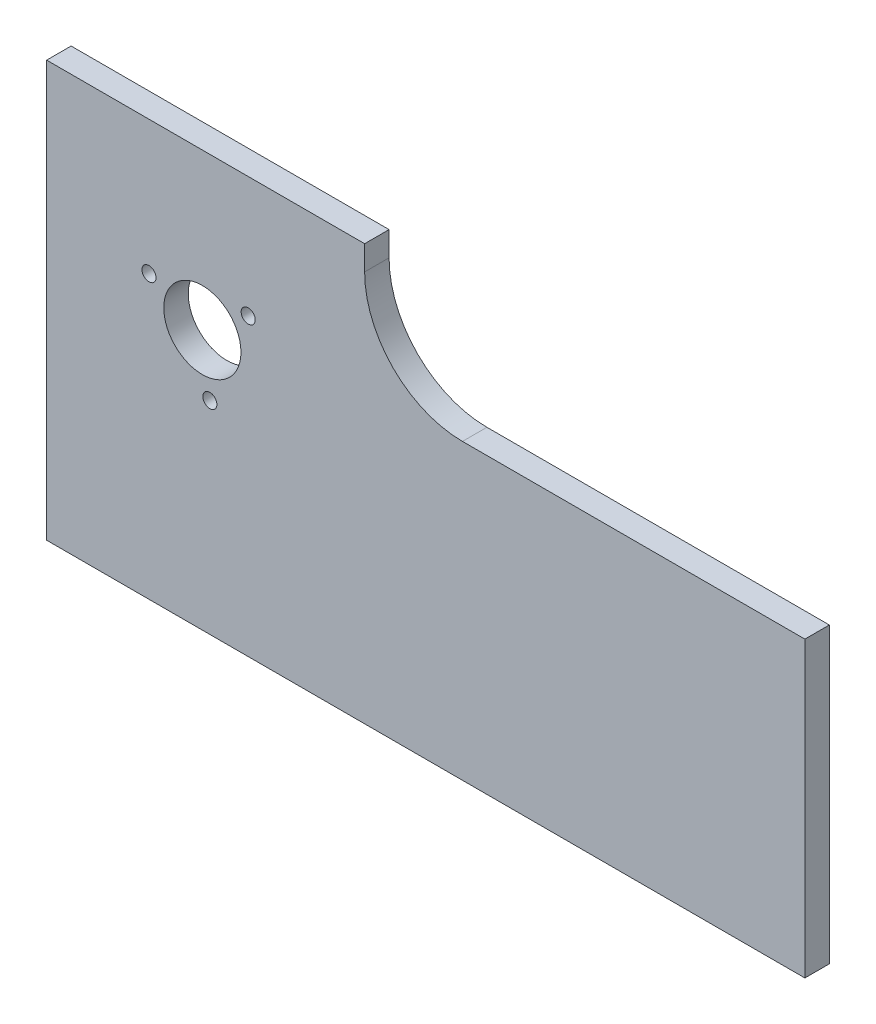
ISO-10303-21;
HEADER;
FILE_DESCRIPTION(('STEP AP214'),'2;1');
FILE_NAME('part.step','',(''),(''),'','','');
FILE_SCHEMA(('AUTOMOTIVE_DESIGN { 1 0 10303 214 1 1 1 1 }'));
ENDSEC;
DATA;
#1=APPLICATION_CONTEXT('core data for automotive mechanical design processes');
#2=APPLICATION_PROTOCOL_DEFINITION('international standard','automotive_design',2000,#1);
#3=PRODUCT_CONTEXT('',#1,'mechanical');
#4=PRODUCT('Part','Part','',(#3));
#5=PRODUCT_RELATED_PRODUCT_CATEGORY('part','',(#4));
#6=PRODUCT_DEFINITION_FORMATION('','',#4);
#7=PRODUCT_DEFINITION_CONTEXT('part definition',#1,'design');
#8=PRODUCT_DEFINITION('design','',#6,#7);
#9=PRODUCT_DEFINITION_SHAPE('','',#8);
#10=(LENGTH_UNIT() NAMED_UNIT(*) SI_UNIT(.MILLI.,.METRE.));
#11=(NAMED_UNIT(*) PLANE_ANGLE_UNIT() SI_UNIT($,.RADIAN.));
#12=(NAMED_UNIT(*) SI_UNIT($,.STERADIAN.) SOLID_ANGLE_UNIT());
#13=UNCERTAINTY_MEASURE_WITH_UNIT(LENGTH_MEASURE(1.E-05),#10,'distance_accuracy_value','');
#14=(GEOMETRIC_REPRESENTATION_CONTEXT(3) GLOBAL_UNCERTAINTY_ASSIGNED_CONTEXT((#13)) GLOBAL_UNIT_ASSIGNED_CONTEXT((#10,
#11,#12)) REPRESENTATION_CONTEXT('',''));
#15=CARTESIAN_POINT('',(0.,0.,0.));
#16=DIRECTION('',(0.,0.,1.));
#17=DIRECTION('',(1.,0.,0.));
#18=AXIS2_PLACEMENT_3D('',#15,#16,#17);
#19=CARTESIAN_POINT('',(114.3,-6.34999999999998,6.35));
#20=DIRECTION('',(0.,1.,0.));
#21=DIRECTION('',(-1.,0.,0.));
#22=AXIS2_PLACEMENT_3D('',#19,#20,#21);
#23=PLANE('',#22);
#24=DIRECTION('',(1.,0.,0.));
#25=VECTOR('',#24,1.);
#26=CARTESIAN_POINT('',(114.3,-6.34999999999998,0.));
#27=LINE('',#26,#25);
#28=CARTESIAN_POINT('',(-82.55,-6.35,0.));
#29=VERTEX_POINT('',#28);
#30=CARTESIAN_POINT('',(114.3,-6.34999999999998,0.));
#31=VERTEX_POINT('',#30);
#32=EDGE_CURVE('E127',#29,#31,#27,.T.);
#33=ORIENTED_EDGE('',*,*,#32,.T.);
#34=DIRECTION('',(0.,0.,-1.));
#35=VECTOR('',#34,1.);
#36=CARTESIAN_POINT('',(114.3,-6.34999999999998,6.35));
#37=LINE('',#36,#35);
#38=CARTESIAN_POINT('',(114.3,-6.34999999999998,6.35));
#39=VERTEX_POINT('',#38);
#40=EDGE_CURVE('E11',#39,#31,#37,.T.);
#41=ORIENTED_EDGE('',*,*,#40,.F.);
#42=DIRECTION('',(1.,0.,0.));
#43=VECTOR('',#42,1.);
#44=CARTESIAN_POINT('',(114.3,-6.34999999999998,6.35));
#45=LINE('',#44,#43);
#46=CARTESIAN_POINT('',(-82.55,-6.35,6.35));
#47=VERTEX_POINT('',#46);
#48=EDGE_CURVE('E140',#47,#39,#45,.T.);
#49=ORIENTED_EDGE('',*,*,#48,.F.);
#50=DIRECTION('',(0.,0.,-1.));
#51=VECTOR('',#50,1.);
#52=CARTESIAN_POINT('',(-82.55,-6.35,6.35));
#53=LINE('',#52,#51);
#54=EDGE_CURVE('E123',#47,#29,#53,.T.);
#55=ORIENTED_EDGE('',*,*,#54,.T.);
#56=EDGE_LOOP('',(#33,#41,#49,#55));
#57=FACE_BOUND('',#56,.T.);
#58=ADVANCED_FACE('F37',(#57),#23,.F.);
#59=CARTESIAN_POINT('',(114.3,69.85,6.35));
#60=DIRECTION('',(-1.,0.,0.));
#61=DIRECTION('',(0.,0.,1.));
#62=AXIS2_PLACEMENT_3D('',#59,#60,#61);
#63=PLANE('',#62);
#64=DIRECTION('',(0.,1.,0.));
#65=VECTOR('',#64,1.);
#66=CARTESIAN_POINT('',(114.3,69.85,0.));
#67=LINE('',#66,#65);
#68=CARTESIAN_POINT('',(114.3,69.85,0.));
#69=VERTEX_POINT('',#68);
#70=EDGE_CURVE('E130',#31,#69,#67,.T.);
#71=ORIENTED_EDGE('',*,*,#70,.T.);
#72=DIRECTION('',(0.,0.,-1.));
#73=VECTOR('',#72,1.);
#74=CARTESIAN_POINT('',(114.3,69.85,6.35));
#75=LINE('',#74,#73);
#76=CARTESIAN_POINT('',(114.3,69.85,6.35));
#77=VERTEX_POINT('',#76);
#78=EDGE_CURVE('E45',#77,#69,#75,.T.);
#79=ORIENTED_EDGE('',*,*,#78,.F.);
#80=DIRECTION('',(0.,1.,0.));
#81=VECTOR('',#80,1.);
#82=CARTESIAN_POINT('',(114.3,69.85,6.35));
#83=LINE('',#82,#81);
#84=EDGE_CURVE('E93',#39,#77,#83,.T.);
#85=ORIENTED_EDGE('',*,*,#84,.F.);
#86=ORIENTED_EDGE('',*,*,#40,.T.);
#87=EDGE_LOOP('',(#71,#79,#85,#86));
#88=FACE_BOUND('',#87,.T.);
#89=ADVANCED_FACE('F220',(#88),#63,.F.);
#90=CARTESIAN_POINT('',(25.4000000000002,69.85,6.35));
#91=DIRECTION('',(0.,-1.,0.));
#92=DIRECTION('',(1.,0.,0.));
#93=AXIS2_PLACEMENT_3D('',#90,#91,#92);
#94=PLANE('',#93);
#95=DIRECTION('',(-1.,0.,0.));
#96=VECTOR('',#95,1.);
#97=CARTESIAN_POINT('',(25.4000000000002,69.85,0.));
#98=LINE('',#97,#96);
#99=CARTESIAN_POINT('',(25.4000000000002,69.85,0.));
#100=VERTEX_POINT('',#99);
#101=EDGE_CURVE('E133',#69,#100,#98,.T.);
#102=ORIENTED_EDGE('',*,*,#101,.T.);
#103=DIRECTION('',(0.,0.,-1.));
#104=VECTOR('',#103,1.);
#105=CARTESIAN_POINT('',(25.4000000000002,69.85,6.35));
#106=LINE('',#105,#104);
#107=CARTESIAN_POINT('',(25.4000000000002,69.85,6.35));
#108=VERTEX_POINT('',#107);
#109=EDGE_CURVE('E144',#108,#100,#106,.T.);
#110=ORIENTED_EDGE('',*,*,#109,.F.);
#111=DIRECTION('',(-1.,0.,0.));
#112=VECTOR('',#111,1.);
#113=CARTESIAN_POINT('',(25.4000000000002,69.85,6.35));
#114=LINE('',#113,#112);
#115=EDGE_CURVE('E152',#77,#108,#114,.T.);
#116=ORIENTED_EDGE('',*,*,#115,.F.);
#117=ORIENTED_EDGE('',*,*,#78,.T.);
#118=EDGE_LOOP('',(#102,#110,#116,#117));
#119=FACE_BOUND('',#118,.T.);
#120=ADVANCED_FACE('F150',(#119),#94,.F.);
#121=CARTESIAN_POINT('',(25.4,95.25,6.35));
#122=DIRECTION('',(0.,0.,-1.));
#123=DIRECTION('',(-1.,0.,0.));
#124=AXIS2_PLACEMENT_3D('',#121,#122,#123);
#125=CYLINDRICAL_SURFACE('',#124,25.4);
#126=CARTESIAN_POINT('',(25.4,95.25,0.));
#127=DIRECTION('',(0.,0.,-1.));
#128=DIRECTION('',(1.,0.,0.));
#129=AXIS2_PLACEMENT_3D('',#126,#127,#128);
#130=CIRCLE('',#129,25.4);
#131=CARTESIAN_POINT('',(0.,95.2500000000002,0.));
#132=VERTEX_POINT('',#131);
#133=EDGE_CURVE('E135',#100,#132,#130,.T.);
#134=ORIENTED_EDGE('',*,*,#133,.T.);
#135=DIRECTION('',(0.,0.,-1.));
#136=VECTOR('',#135,1.);
#137=CARTESIAN_POINT('',(0.,95.2500000000002,6.35));
#138=LINE('',#137,#136);
#139=CARTESIAN_POINT('',(0.,95.2500000000002,6.35));
#140=VERTEX_POINT('',#139);
#141=EDGE_CURVE('E118',#140,#132,#138,.T.);
#142=ORIENTED_EDGE('',*,*,#141,.F.);
#143=CARTESIAN_POINT('',(25.4,95.25,6.35));
#144=DIRECTION('',(0.,0.,-1.));
#145=DIRECTION('',(1.,0.,0.));
#146=AXIS2_PLACEMENT_3D('',#143,#144,#145);
#147=CIRCLE('',#146,25.4);
#148=EDGE_CURVE('E109',#108,#140,#147,.T.);
#149=ORIENTED_EDGE('',*,*,#148,.F.);
#150=ORIENTED_EDGE('',*,*,#109,.T.);
#151=EDGE_LOOP('',(#134,#142,#149,#150));
#152=FACE_BOUND('',#151,.T.);
#153=ADVANCED_FACE('F158',(#152),#125,.F.);
#154=CARTESIAN_POINT('',(0.,95.2500000000002,6.35));
#155=DIRECTION('',(-1.,0.,0.));
#156=DIRECTION('',(0.,-1.,0.));
#157=AXIS2_PLACEMENT_3D('',#154,#155,#156);
#158=PLANE('',#157);
#159=DIRECTION('',(0.,1.,0.));
#160=VECTOR('',#159,1.);
#161=CARTESIAN_POINT('',(0.,95.2500000000002,0.));
#162=LINE('',#161,#160);
#163=CARTESIAN_POINT('',(0.,101.6,0.));
#164=VERTEX_POINT('',#163);
#165=EDGE_CURVE('E117',#132,#164,#162,.T.);
#166=ORIENTED_EDGE('',*,*,#165,.T.);
#167=DIRECTION('',(0.,0.,-1.));
#168=VECTOR('',#167,1.);
#169=CARTESIAN_POINT('',(0.,101.6,6.35));
#170=LINE('',#169,#168);
#171=CARTESIAN_POINT('',(0.,101.6,6.35));
#172=VERTEX_POINT('',#171);
#173=EDGE_CURVE('E114',#172,#164,#170,.T.);
#174=ORIENTED_EDGE('',*,*,#173,.F.);
#175=DIRECTION('',(0.,1.,0.));
#176=VECTOR('',#175,1.);
#177=CARTESIAN_POINT('',(0.,95.2500000000002,6.35));
#178=LINE('',#177,#176);
#179=EDGE_CURVE('E103',#140,#172,#178,.T.);
#180=ORIENTED_EDGE('',*,*,#179,.F.);
#181=ORIENTED_EDGE('',*,*,#141,.T.);
#182=EDGE_LOOP('',(#166,#174,#180,#181));
#183=FACE_BOUND('',#182,.T.);
#184=ADVANCED_FACE('F115',(#183),#158,.F.);
#185=CARTESIAN_POINT('',(-82.55,101.6,6.35));
#186=DIRECTION('',(0.,-1.,0.));
#187=DIRECTION('',(0.,0.,-1.));
#188=AXIS2_PLACEMENT_3D('',#185,#186,#187);
#189=PLANE('',#188);
#190=DIRECTION('',(-1.,0.,0.));
#191=VECTOR('',#190,1.);
#192=CARTESIAN_POINT('',(-82.55,101.6,0.));
#193=LINE('',#192,#191);
#194=CARTESIAN_POINT('',(-82.55,101.6,0.));
#195=VERTEX_POINT('',#194);
#196=EDGE_CURVE('E79',#164,#195,#193,.T.);
#197=ORIENTED_EDGE('',*,*,#196,.T.);
#198=DIRECTION('',(0.,0.,-1.));
#199=VECTOR('',#198,1.);
#200=CARTESIAN_POINT('',(-82.55,101.6,6.35));
#201=LINE('',#200,#199);
#202=CARTESIAN_POINT('',(-82.55,101.6,6.35));
#203=VERTEX_POINT('',#202);
#204=EDGE_CURVE('E119',#203,#195,#201,.T.);
#205=ORIENTED_EDGE('',*,*,#204,.F.);
#206=DIRECTION('',(-1.,0.,0.));
#207=VECTOR('',#206,1.);
#208=CARTESIAN_POINT('',(-82.55,101.6,6.35));
#209=LINE('',#208,#207);
#210=EDGE_CURVE('E107',#172,#203,#209,.T.);
#211=ORIENTED_EDGE('',*,*,#210,.F.);
#212=ORIENTED_EDGE('',*,*,#173,.T.);
#213=EDGE_LOOP('',(#197,#205,#211,#212));
#214=FACE_BOUND('',#213,.T.);
#215=ADVANCED_FACE('F121',(#214),#189,.F.);
#216=CARTESIAN_POINT('',(-82.55,-6.35,6.35));
#217=DIRECTION('',(1.,0.,0.));
#218=DIRECTION('',(0.,0.,-1.));
#219=AXIS2_PLACEMENT_3D('',#216,#217,#218);
#220=PLANE('',#219);
#221=DIRECTION('',(0.,-1.,0.));
#222=VECTOR('',#221,1.);
#223=CARTESIAN_POINT('',(-82.55,-6.35,0.));
#224=LINE('',#223,#222);
#225=EDGE_CURVE('E85',#195,#29,#224,.T.);
#226=ORIENTED_EDGE('',*,*,#225,.T.);
#227=ORIENTED_EDGE('',*,*,#54,.F.);
#228=DIRECTION('',(0.,-1.,0.));
#229=VECTOR('',#228,1.);
#230=CARTESIAN_POINT('',(-82.55,-6.35,6.35));
#231=LINE('',#230,#229);
#232=EDGE_CURVE('E53',#203,#47,#231,.T.);
#233=ORIENTED_EDGE('',*,*,#232,.F.);
#234=ORIENTED_EDGE('',*,*,#204,.T.);
#235=EDGE_LOOP('',(#226,#227,#233,#234));
#236=FACE_BOUND('',#235,.T.);
#237=ADVANCED_FACE('F198',(#236),#220,.F.);
#238=CARTESIAN_POINT('',(25.4,95.25,6.35));
#239=DIRECTION('',(0.,0.,1.));
#240=DIRECTION('',(1.,0.,0.));
#241=AXIS2_PLACEMENT_3D('',#238,#239,#240);
#242=PLANE('',#241);
#243=CARTESIAN_POINT('',(-40.1766524814024,46.2502246913864,6.35));
#244=DIRECTION('',(0.,0.,1.));
#245=DIRECTION('',(1.,0.,0.));
#246=AXIS2_PLACEMENT_3D('',#243,#244,#245);
#247=CIRCLE('',#246,1.8288);
#248=CARTESIAN_POINT('',(-38.3478524814024,46.2502246913864,6.35));
#249=VERTEX_POINT('',#248);
#250=EDGE_CURVE('E181',#249,#249,#247,.T.);
#251=ORIENTED_EDGE('',*,*,#250,.F.);
#252=EDGE_LOOP('',(#251));
#253=FACE_BOUND('',#252,.T.);
#254=CARTESIAN_POINT('',(-55.9845803835544,66.86840636292,6.35));
#255=DIRECTION('',(0.,0.,1.));
#256=DIRECTION('',(1.,0.,0.));
#257=AXIS2_PLACEMENT_3D('',#254,#255,#256);
#258=CIRCLE('',#257,1.8288);
#259=CARTESIAN_POINT('',(-54.1557803835544,66.86840636292,6.35));
#260=VERTEX_POINT('',#259);
#261=EDGE_CURVE('E175',#260,#260,#258,.T.);
#262=ORIENTED_EDGE('',*,*,#261,.F.);
#263=EDGE_LOOP('',(#262));
#264=FACE_BOUND('',#263,.T.);
#265=CARTESIAN_POINT('',(-30.2247473250876,70.2493826716096,6.35));
#266=DIRECTION('',(0.,0.,1.));
#267=DIRECTION('',(1.,0.,0.));
#268=AXIS2_PLACEMENT_3D('',#265,#266,#267);
#269=CIRCLE('',#268,1.8288);
#270=CARTESIAN_POINT('',(-28.3959473250876,70.2493826716096,6.35));
#271=VERTEX_POINT('',#270);
#272=EDGE_CURVE('E169',#271,#271,#269,.T.);
#273=ORIENTED_EDGE('',*,*,#272,.F.);
#274=EDGE_LOOP('',(#273));
#275=FACE_BOUND('',#274,.T.);
#276=CARTESIAN_POINT('',(-42.1286600633483,61.1226712419714,6.35));
#277=DIRECTION('',(0.,0.,1.));
#278=DIRECTION('',(1.,0.,0.));
#279=AXIS2_PLACEMENT_3D('',#276,#277,#278);
#280=CIRCLE('',#279,10.0203);
#281=CARTESIAN_POINT('',(-32.1083600633483,61.1226712419714,6.35));
#282=VERTEX_POINT('',#281);
#283=EDGE_CURVE('E163',#282,#282,#280,.T.);
#284=ORIENTED_EDGE('',*,*,#283,.F.);
#285=EDGE_LOOP('',(#284));
#286=FACE_BOUND('',#285,.T.);
#287=ORIENTED_EDGE('',*,*,#48,.T.);
#288=ORIENTED_EDGE('',*,*,#84,.T.);
#289=ORIENTED_EDGE('',*,*,#115,.T.);
#290=ORIENTED_EDGE('',*,*,#148,.T.);
#291=ORIENTED_EDGE('',*,*,#179,.T.);
#292=ORIENTED_EDGE('',*,*,#210,.T.);
#293=ORIENTED_EDGE('',*,*,#232,.T.);
#294=EDGE_LOOP('',(#287,#288,#289,#290,#291,#292,#293));
#295=FACE_BOUND('',#294,.T.);
#296=ADVANCED_FACE('F105',(#253,#264,#275,#286,#295),#242,.T.);
#297=CARTESIAN_POINT('',(25.4,95.25,0.));
#298=DIRECTION('',(0.,0.,1.));
#299=DIRECTION('',(1.,0.,0.));
#300=AXIS2_PLACEMENT_3D('',#297,#298,#299);
#301=PLANE('',#300);
#302=CARTESIAN_POINT('',(-40.1766524814024,46.2502246913864,0.));
#303=DIRECTION('',(0.,0.,1.));
#304=DIRECTION('',(1.,0.,0.));
#305=AXIS2_PLACEMENT_3D('',#302,#303,#304);
#306=CIRCLE('',#305,1.8288);
#307=CARTESIAN_POINT('',(-38.3478524814024,46.2502246913864,0.));
#308=VERTEX_POINT('',#307);
#309=EDGE_CURVE('E178',#308,#308,#306,.T.);
#310=ORIENTED_EDGE('',*,*,#309,.T.);
#311=EDGE_LOOP('',(#310));
#312=FACE_BOUND('',#311,.T.);
#313=CARTESIAN_POINT('',(-55.9845803835544,66.86840636292,0.));
#314=DIRECTION('',(0.,0.,1.));
#315=DIRECTION('',(1.,0.,0.));
#316=AXIS2_PLACEMENT_3D('',#313,#314,#315);
#317=CIRCLE('',#316,1.8288);
#318=CARTESIAN_POINT('',(-54.1557803835544,66.86840636292,0.));
#319=VERTEX_POINT('',#318);
#320=EDGE_CURVE('E172',#319,#319,#317,.T.);
#321=ORIENTED_EDGE('',*,*,#320,.T.);
#322=EDGE_LOOP('',(#321));
#323=FACE_BOUND('',#322,.T.);
#324=CARTESIAN_POINT('',(-30.2247473250876,70.2493826716096,0.));
#325=DIRECTION('',(0.,0.,1.));
#326=DIRECTION('',(1.,0.,0.));
#327=AXIS2_PLACEMENT_3D('',#324,#325,#326);
#328=CIRCLE('',#327,1.8288);
#329=CARTESIAN_POINT('',(-28.3959473250876,70.2493826716096,0.));
#330=VERTEX_POINT('',#329);
#331=EDGE_CURVE('E166',#330,#330,#328,.T.);
#332=ORIENTED_EDGE('',*,*,#331,.T.);
#333=EDGE_LOOP('',(#332));
#334=FACE_BOUND('',#333,.T.);
#335=CARTESIAN_POINT('',(-42.1286600633483,61.1226712419714,0.));
#336=DIRECTION('',(0.,0.,1.));
#337=DIRECTION('',(1.,0.,0.));
#338=AXIS2_PLACEMENT_3D('',#335,#336,#337);
#339=CIRCLE('',#338,10.0203);
#340=CARTESIAN_POINT('',(-32.1083600633483,61.1226712419714,0.));
#341=VERTEX_POINT('',#340);
#342=EDGE_CURVE('E131',#341,#341,#339,.T.);
#343=ORIENTED_EDGE('',*,*,#342,.T.);
#344=EDGE_LOOP('',(#343));
#345=FACE_BOUND('',#344,.T.);
#346=ORIENTED_EDGE('',*,*,#32,.F.);
#347=ORIENTED_EDGE('',*,*,#225,.F.);
#348=ORIENTED_EDGE('',*,*,#196,.F.);
#349=ORIENTED_EDGE('',*,*,#165,.F.);
#350=ORIENTED_EDGE('',*,*,#133,.F.);
#351=ORIENTED_EDGE('',*,*,#101,.F.);
#352=ORIENTED_EDGE('',*,*,#70,.F.);
#353=EDGE_LOOP('',(#346,#347,#348,#349,#350,#351,#352));
#354=FACE_BOUND('',#353,.T.);
#355=ADVANCED_FACE('F156',(#312,#323,#334,#345,#354),#301,.F.);
#356=CARTESIAN_POINT('',(-42.1286600633483,61.1226712419714,0.));
#357=DIRECTION('',(0.,0.,1.));
#358=DIRECTION('',(1.,0.,0.));
#359=AXIS2_PLACEMENT_3D('',#356,#357,#358);
#360=CYLINDRICAL_SURFACE('',#359,10.0203);
#361=ORIENTED_EDGE('',*,*,#342,.F.);
#362=EDGE_LOOP('',(#361));
#363=FACE_BOUND('',#362,.T.);
#364=ORIENTED_EDGE('',*,*,#283,.T.);
#365=EDGE_LOOP('',(#364));
#366=FACE_BOUND('',#365,.T.);
#367=ADVANCED_FACE('F206',(#363,#366),#360,.F.);
#368=CARTESIAN_POINT('',(-30.2247473250876,70.2493826716096,0.));
#369=DIRECTION('',(0.,0.,1.));
#370=DIRECTION('',(1.,0.,0.));
#371=AXIS2_PLACEMENT_3D('',#368,#369,#370);
#372=CYLINDRICAL_SURFACE('',#371,1.8288);
#373=ORIENTED_EDGE('',*,*,#331,.F.);
#374=EDGE_LOOP('',(#373));
#375=FACE_BOUND('',#374,.T.);
#376=ORIENTED_EDGE('',*,*,#272,.T.);
#377=EDGE_LOOP('',(#376));
#378=FACE_BOUND('',#377,.T.);
#379=ADVANCED_FACE('F208',(#375,#378),#372,.F.);
#380=CARTESIAN_POINT('',(-55.9845803835544,66.86840636292,0.));
#381=DIRECTION('',(0.,0.,1.));
#382=DIRECTION('',(1.,0.,0.));
#383=AXIS2_PLACEMENT_3D('',#380,#381,#382);
#384=CYLINDRICAL_SURFACE('',#383,1.8288);
#385=ORIENTED_EDGE('',*,*,#320,.F.);
#386=EDGE_LOOP('',(#385));
#387=FACE_BOUND('',#386,.T.);
#388=ORIENTED_EDGE('',*,*,#261,.T.);
#389=EDGE_LOOP('',(#388));
#390=FACE_BOUND('',#389,.T.);
#391=ADVANCED_FACE('F192',(#387,#390),#384,.F.);
#392=CARTESIAN_POINT('',(-40.1766524814024,46.2502246913864,0.));
#393=DIRECTION('',(0.,0.,1.));
#394=DIRECTION('',(1.,0.,0.));
#395=AXIS2_PLACEMENT_3D('',#392,#393,#394);
#396=CYLINDRICAL_SURFACE('',#395,1.8288);
#397=ORIENTED_EDGE('',*,*,#309,.F.);
#398=EDGE_LOOP('',(#397));
#399=FACE_BOUND('',#398,.T.);
#400=ORIENTED_EDGE('',*,*,#250,.T.);
#401=EDGE_LOOP('',(#400));
#402=FACE_BOUND('',#401,.T.);
#403=ADVANCED_FACE('F189',(#399,#402),#396,.F.);
#404=CLOSED_SHELL('',(#58,#89,#120,#153,#184,#215,#237,#296,#355,#367,#379,#391,#403));
#405=MANIFOLD_SOLID_BREP('B2',#404);
#406=ADVANCED_BREP_SHAPE_REPRESENTATION('',(#18,#405),#14);
#407=SHAPE_DEFINITION_REPRESENTATION(#9,#406);
ENDSEC;
END-ISO-10303-21;
